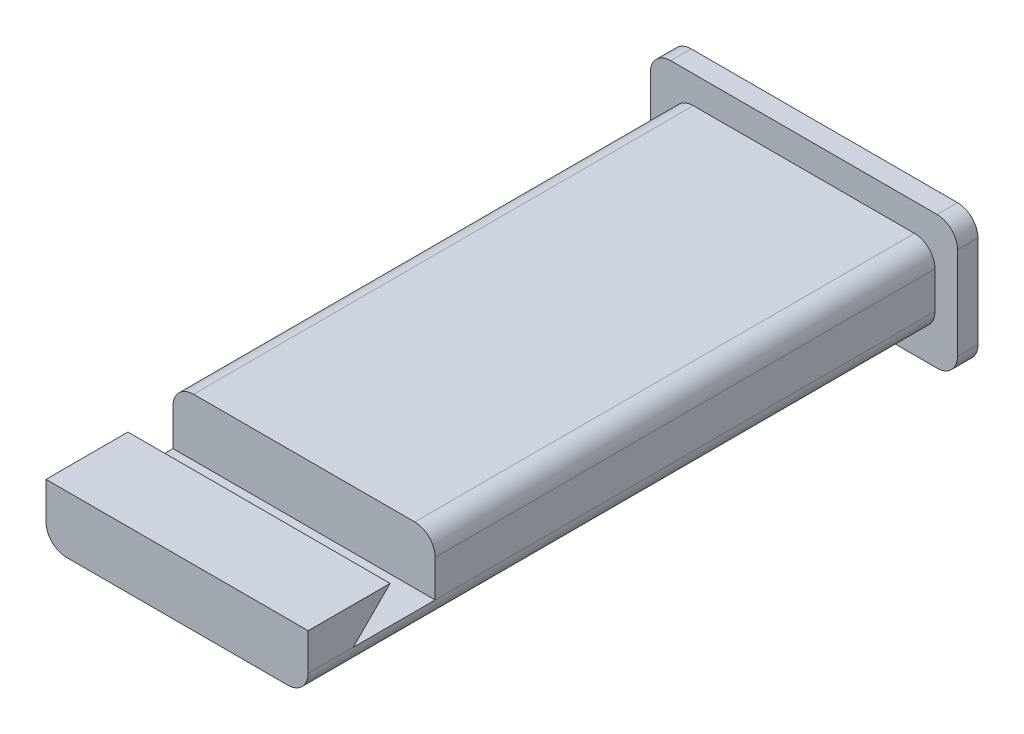
ISO-10303-21;
HEADER;
FILE_DESCRIPTION(('STEP AP214'),'2;1');
FILE_NAME('part.step','',(''),(''),'','','');
FILE_SCHEMA(('AUTOMOTIVE_DESIGN { 1 0 10303 214 1 1 1 1 }'));
ENDSEC;
DATA;
#1=APPLICATION_CONTEXT('core data for automotive mechanical design processes');
#2=APPLICATION_PROTOCOL_DEFINITION('international standard','automotive_design',2000,#1);
#3=PRODUCT_CONTEXT('',#1,'mechanical');
#4=PRODUCT('Part','Part','',(#3));
#5=PRODUCT_RELATED_PRODUCT_CATEGORY('part','',(#4));
#6=PRODUCT_DEFINITION_FORMATION('','',#4);
#7=PRODUCT_DEFINITION_CONTEXT('part definition',#1,'design');
#8=PRODUCT_DEFINITION('design','',#6,#7);
#9=PRODUCT_DEFINITION_SHAPE('','',#8);
#10=(LENGTH_UNIT() NAMED_UNIT(*) SI_UNIT(.MILLI.,.METRE.));
#11=(NAMED_UNIT(*) PLANE_ANGLE_UNIT() SI_UNIT($,.RADIAN.));
#12=(NAMED_UNIT(*) SI_UNIT($,.STERADIAN.) SOLID_ANGLE_UNIT());
#13=UNCERTAINTY_MEASURE_WITH_UNIT(LENGTH_MEASURE(1.E-05),#10,'distance_accuracy_value','');
#14=(GEOMETRIC_REPRESENTATION_CONTEXT(3) GLOBAL_UNCERTAINTY_ASSIGNED_CONTEXT((#13)) GLOBAL_UNIT_ASSIGNED_CONTEXT((#10,
#11,#12)) REPRESENTATION_CONTEXT('',''));
#15=CARTESIAN_POINT('',(0.,0.,0.));
#16=DIRECTION('',(0.,0.,1.));
#17=DIRECTION('',(1.,0.,0.));
#18=AXIS2_PLACEMENT_3D('',#15,#16,#17);
#19=CARTESIAN_POINT('',(12.8,-3.8,61.2));
#20=DIRECTION('',(-1.,0.,0.));
#21=DIRECTION('',(0.,0.,1.));
#22=AXIS2_PLACEMENT_3D('',#19,#20,#21);
#23=PLANE('',#22);
#24=DIRECTION('',(0.,0.,-1.));
#25=VECTOR('',#24,1.);
#26=CARTESIAN_POINT('',(12.8,1.8,61.2));
#27=LINE('',#26,#25);
#28=CARTESIAN_POINT('',(12.8,1.8,0.));
#29=VERTEX_POINT('',#28);
#30=CARTESIAN_POINT('',(12.8,1.8,48.8));
#31=VERTEX_POINT('',#30);
#32=EDGE_CURVE('E203',#29,#31,#27,.F.);
#33=ORIENTED_EDGE('',*,*,#32,.T.);
#34=DIRECTION('',(0.,-1.,0.));
#35=VECTOR('',#34,1.);
#36=CARTESIAN_POINT('',(12.8,3.8,48.8));
#37=LINE('',#36,#35);
#38=CARTESIAN_POINT('',(12.8,-1.8,48.8));
#39=VERTEX_POINT('',#38);
#40=EDGE_CURVE('E178',#31,#39,#37,.T.);
#41=ORIENTED_EDGE('',*,*,#40,.T.);
#42=DIRECTION('',(0.,0.,-1.));
#43=VECTOR('',#42,1.);
#44=CARTESIAN_POINT('',(12.8,-1.8,61.2));
#45=LINE('',#44,#43);
#46=CARTESIAN_POINT('',(12.8,-1.8,0.));
#47=VERTEX_POINT('',#46);
#48=EDGE_CURVE('E200',#39,#47,#45,.T.);
#49=ORIENTED_EDGE('',*,*,#48,.T.);
#50=DIRECTION('',(0.,1.,0.));
#51=VECTOR('',#50,1.);
#52=CARTESIAN_POINT('',(12.8,-3.8,0.));
#53=LINE('',#52,#51);
#54=EDGE_CURVE('E302',#47,#29,#53,.T.);
#55=ORIENTED_EDGE('',*,*,#54,.T.);
#56=EDGE_LOOP('',(#33,#41,#49,#55));
#57=FACE_BOUND('',#56,.T.);
#58=ADVANCED_FACE('F37',(#57),#23,.F.);
#59=CARTESIAN_POINT('',(-12.8,-3.8,61.2));
#60=DIRECTION('',(1.,0.,0.));
#61=DIRECTION('',(0.,0.,-1.));
#62=AXIS2_PLACEMENT_3D('',#59,#60,#61);
#63=PLANE('',#62);
#64=DIRECTION('',(0.,0.,-1.));
#65=VECTOR('',#64,1.);
#66=CARTESIAN_POINT('',(-12.8,-1.8,61.2));
#67=LINE('',#66,#65);
#68=CARTESIAN_POINT('',(-12.8,-1.8,0.));
#69=VERTEX_POINT('',#68);
#70=CARTESIAN_POINT('',(-12.8,-1.8,48.8));
#71=VERTEX_POINT('',#70);
#72=EDGE_CURVE('E330',#69,#71,#67,.F.);
#73=ORIENTED_EDGE('',*,*,#72,.T.);
#74=DIRECTION('',(0.,-1.,0.));
#75=VECTOR('',#74,1.);
#76=CARTESIAN_POINT('',(-12.8,3.8,48.8));
#77=LINE('',#76,#75);
#78=CARTESIAN_POINT('',(-12.8,1.8,48.8));
#79=VERTEX_POINT('',#78);
#80=EDGE_CURVE('E181',#79,#71,#77,.T.);
#81=ORIENTED_EDGE('',*,*,#80,.F.);
#82=DIRECTION('',(0.,0.,-1.));
#83=VECTOR('',#82,1.);
#84=CARTESIAN_POINT('',(-12.8,1.8,61.2));
#85=LINE('',#84,#83);
#86=CARTESIAN_POINT('',(-12.8,1.8,0.));
#87=VERTEX_POINT('',#86);
#88=EDGE_CURVE('E325',#79,#87,#85,.T.);
#89=ORIENTED_EDGE('',*,*,#88,.T.);
#90=DIRECTION('',(0.,-1.,0.));
#91=VECTOR('',#90,1.);
#92=CARTESIAN_POINT('',(-12.8,-3.8,0.));
#93=LINE('',#92,#91);
#94=EDGE_CURVE('E308',#87,#69,#93,.T.);
#95=ORIENTED_EDGE('',*,*,#94,.T.);
#96=EDGE_LOOP('',(#73,#81,#89,#95));
#97=FACE_BOUND('',#96,.T.);
#98=ADVANCED_FACE('F391',(#97),#63,.F.);
#99=CARTESIAN_POINT('',(12.8,-1.8,61.2));
#100=VERTEX_POINT('',#99);
#101=CARTESIAN_POINT('',(12.8,-1.8,56.8));
#102=VERTEX_POINT('',#101);
#103=EDGE_CURVE('E211',#100,#102,#45,.T.);
#104=ORIENTED_EDGE('',*,*,#103,.T.);
#105=DIRECTION('',(0.,0.707106781186544,-0.707106781186551));
#106=VECTOR('',#105,1.);
#107=CARTESIAN_POINT('',(12.8,-1.8,56.8));
#108=LINE('',#107,#106);
#109=CARTESIAN_POINT('',(12.8,1.8,53.2));
#110=VERTEX_POINT('',#109);
#111=EDGE_CURVE('E196',#102,#110,#108,.T.);
#112=ORIENTED_EDGE('',*,*,#111,.T.);
#113=DIRECTION('',(0.,0.,1.));
#114=VECTOR('',#113,1.);
#115=CARTESIAN_POINT('',(12.8,1.8,53.2));
#116=LINE('',#115,#114);
#117=CARTESIAN_POINT('',(12.8,1.8,61.2));
#118=VERTEX_POINT('',#117);
#119=EDGE_CURVE('E186',#110,#118,#116,.T.);
#120=ORIENTED_EDGE('',*,*,#119,.T.);
#121=DIRECTION('',(0.,1.,0.));
#122=VECTOR('',#121,1.);
#123=CARTESIAN_POINT('',(12.8,-3.8,61.2));
#124=LINE('',#123,#122);
#125=EDGE_CURVE('E291',#100,#118,#124,.T.);
#126=ORIENTED_EDGE('',*,*,#125,.F.);
#127=EDGE_LOOP('',(#104,#112,#120,#126));
#128=FACE_BOUND('',#127,.T.);
#129=ADVANCED_FACE('F353',(#128),#23,.F.);
#130=CARTESIAN_POINT('',(-12.8,3.8,61.2));
#131=DIRECTION('',(0.,-1.,0.));
#132=DIRECTION('',(0.,0.,-1.));
#133=AXIS2_PLACEMENT_3D('',#130,#131,#132);
#134=PLANE('',#133);
#135=DIRECTION('',(0.,0.,-1.));
#136=VECTOR('',#135,1.);
#137=CARTESIAN_POINT('',(-10.8,3.8,61.2));
#138=LINE('',#137,#136);
#139=CARTESIAN_POINT('',(-10.8,3.8,0.));
#140=VERTEX_POINT('',#139);
#141=CARTESIAN_POINT('',(-10.8,3.8,48.8));
#142=VERTEX_POINT('',#141);
#143=EDGE_CURVE('E213',#140,#142,#138,.F.);
#144=ORIENTED_EDGE('',*,*,#143,.T.);
#145=DIRECTION('',(-1.,0.,0.));
#146=VECTOR('',#145,1.);
#147=CARTESIAN_POINT('',(12.8,3.8,48.8));
#148=LINE('',#147,#146);
#149=CARTESIAN_POINT('',(10.8,3.8,48.8));
#150=VERTEX_POINT('',#149);
#151=EDGE_CURVE('E364',#150,#142,#148,.T.);
#152=ORIENTED_EDGE('',*,*,#151,.F.);
#153=DIRECTION('',(0.,0.,-1.));
#154=VECTOR('',#153,1.);
#155=CARTESIAN_POINT('',(10.8,3.8,61.2));
#156=LINE('',#155,#154);
#157=CARTESIAN_POINT('',(10.8,3.8,0.));
#158=VERTEX_POINT('',#157);
#159=EDGE_CURVE('E220',#150,#158,#156,.T.);
#160=ORIENTED_EDGE('',*,*,#159,.T.);
#161=DIRECTION('',(-1.,0.,0.));
#162=VECTOR('',#161,1.);
#163=CARTESIAN_POINT('',(-12.8,3.8,0.));
#164=LINE('',#163,#162);
#165=EDGE_CURVE('E304',#158,#140,#164,.T.);
#166=ORIENTED_EDGE('',*,*,#165,.T.);
#167=EDGE_LOOP('',(#144,#152,#160,#166));
#168=FACE_BOUND('',#167,.T.);
#169=ADVANCED_FACE('F402',(#168),#134,.F.);
#170=CARTESIAN_POINT('',(-12.8,1.8,61.2));
#171=VERTEX_POINT('',#170);
#172=CARTESIAN_POINT('',(-12.8,1.8,53.2));
#173=VERTEX_POINT('',#172);
#174=EDGE_CURVE('E326',#171,#173,#85,.T.);
#175=ORIENTED_EDGE('',*,*,#174,.T.);
#176=DIRECTION('',(0.,0.707106781186544,-0.707106781186551));
#177=VECTOR('',#176,1.);
#178=CARTESIAN_POINT('',(-12.8,-1.8,56.8));
#179=LINE('',#178,#177);
#180=CARTESIAN_POINT('',(-12.8,-1.8,56.8));
#181=VERTEX_POINT('',#180);
#182=EDGE_CURVE('E52',#181,#173,#179,.T.);
#183=ORIENTED_EDGE('',*,*,#182,.F.);
#184=CARTESIAN_POINT('',(-12.8,-1.8,61.2));
#185=VERTEX_POINT('',#184);
#186=EDGE_CURVE('E329',#181,#185,#67,.F.);
#187=ORIENTED_EDGE('',*,*,#186,.T.);
#188=DIRECTION('',(0.,-1.,0.));
#189=VECTOR('',#188,1.);
#190=CARTESIAN_POINT('',(-12.8,-3.8,61.2));
#191=LINE('',#190,#189);
#192=EDGE_CURVE('E294',#171,#185,#191,.T.);
#193=ORIENTED_EDGE('',*,*,#192,.F.);
#194=EDGE_LOOP('',(#175,#183,#187,#193));
#195=FACE_BOUND('',#194,.T.);
#196=ADVANCED_FACE('F398',(#195),#63,.F.);
#197=CARTESIAN_POINT('',(-12.8,-3.8,61.2));
#198=DIRECTION('',(0.,1.,0.));
#199=DIRECTION('',(0.,0.,1.));
#200=AXIS2_PLACEMENT_3D('',#197,#198,#199);
#201=PLANE('',#200);
#202=DIRECTION('',(1.,0.,0.));
#203=VECTOR('',#202,1.);
#204=CARTESIAN_POINT('',(-12.8,-3.8,61.2));
#205=LINE('',#204,#203);
#206=CARTESIAN_POINT('',(-10.8,-3.8,61.2));
#207=VERTEX_POINT('',#206);
#208=CARTESIAN_POINT('',(10.8,-3.8,61.2));
#209=VERTEX_POINT('',#208);
#210=EDGE_CURVE('E298',#207,#209,#205,.T.);
#211=ORIENTED_EDGE('',*,*,#210,.F.);
#212=DIRECTION('',(0.,0.,-1.));
#213=VECTOR('',#212,1.);
#214=CARTESIAN_POINT('',(-10.8,-3.8,61.2));
#215=LINE('',#214,#213);
#216=CARTESIAN_POINT('',(-10.8,-3.8,0.));
#217=VERTEX_POINT('',#216);
#218=EDGE_CURVE('E312',#207,#217,#215,.T.);
#219=ORIENTED_EDGE('',*,*,#218,.T.);
#220=DIRECTION('',(1.,0.,0.));
#221=VECTOR('',#220,1.);
#222=CARTESIAN_POINT('',(-12.8,-3.8,0.));
#223=LINE('',#222,#221);
#224=CARTESIAN_POINT('',(10.8,-3.8,0.));
#225=VERTEX_POINT('',#224);
#226=EDGE_CURVE('E295',#217,#225,#223,.T.);
#227=ORIENTED_EDGE('',*,*,#226,.T.);
#228=DIRECTION('',(0.,0.,-1.));
#229=VECTOR('',#228,1.);
#230=CARTESIAN_POINT('',(10.8,-3.8,61.2));
#231=LINE('',#230,#229);
#232=EDGE_CURVE('E301',#225,#209,#231,.F.);
#233=ORIENTED_EDGE('',*,*,#232,.T.);
#234=EDGE_LOOP('',(#211,#219,#227,#233));
#235=FACE_BOUND('',#234,.T.);
#236=ADVANCED_FACE('F344',(#235),#201,.F.);
#237=CARTESIAN_POINT('',(0.,0.,61.2));
#238=DIRECTION('',(0.,0.,-1.));
#239=DIRECTION('',(-1.,0.,0.));
#240=AXIS2_PLACEMENT_3D('',#237,#238,#239);
#241=PLANE('',#240);
#242=ORIENTED_EDGE('',*,*,#125,.T.);
#243=DIRECTION('',(-1.,0.,0.));
#244=VECTOR('',#243,1.);
#245=CARTESIAN_POINT('',(12.8,1.8,61.2));
#246=LINE('',#245,#244);
#247=EDGE_CURVE('E367',#118,#171,#246,.T.);
#248=ORIENTED_EDGE('',*,*,#247,.T.);
#249=ORIENTED_EDGE('',*,*,#192,.T.);
#250=CARTESIAN_POINT('',(-10.8,-1.8,61.2));
#251=DIRECTION('',(0.,0.,-1.));
#252=DIRECTION('',(-1.,0.,0.));
#253=AXIS2_PLACEMENT_3D('',#250,#251,#252);
#254=CIRCLE('',#253,2.);
#255=EDGE_CURVE('E214',#185,#207,#254,.F.);
#256=ORIENTED_EDGE('',*,*,#255,.T.);
#257=ORIENTED_EDGE('',*,*,#210,.T.);
#258=CARTESIAN_POINT('',(10.8,-1.8,61.2));
#259=DIRECTION('',(0.,0.,-1.));
#260=DIRECTION('',(-1.,0.,0.));
#261=AXIS2_PLACEMENT_3D('',#258,#259,#260);
#262=CIRCLE('',#261,2.);
#263=EDGE_CURVE('E333',#209,#100,#262,.F.);
#264=ORIENTED_EDGE('',*,*,#263,.T.);
#265=EDGE_LOOP('',(#242,#248,#249,#256,#257,#264));
#266=FACE_BOUND('',#265,.T.);
#267=ADVANCED_FACE('F337',(#266),#241,.F.);
#268=CARTESIAN_POINT('',(-10.8,-1.8,61.2));
#269=DIRECTION('',(0.,0.,-1.));
#270=DIRECTION('',(-1.,0.,0.));
#271=AXIS2_PLACEMENT_3D('',#268,#269,#270);
#272=CYLINDRICAL_SURFACE('',#271,2.);
#273=ORIENTED_EDGE('',*,*,#255,.F.);
#274=ORIENTED_EDGE('',*,*,#186,.F.);
#275=DIRECTION('',(0.,0.,1.));
#276=VECTOR('',#275,1.);
#277=CARTESIAN_POINT('',(-12.8,-1.8,48.8));
#278=LINE('',#277,#276);
#279=EDGE_CURVE('E361',#71,#181,#278,.T.);
#280=ORIENTED_EDGE('',*,*,#279,.F.);
#281=ORIENTED_EDGE('',*,*,#72,.F.);
#282=CARTESIAN_POINT('',(-10.8,-1.8,0.));
#283=DIRECTION('',(0.,0.,-1.));
#284=DIRECTION('',(-1.,0.,0.));
#285=AXIS2_PLACEMENT_3D('',#282,#283,#284);
#286=CIRCLE('',#285,2.);
#287=EDGE_CURVE('E322',#217,#69,#286,.T.);
#288=ORIENTED_EDGE('',*,*,#287,.F.);
#289=ORIENTED_EDGE('',*,*,#218,.F.);
#290=EDGE_LOOP('',(#273,#274,#280,#281,#288,#289));
#291=FACE_BOUND('',#290,.T.);
#292=ADVANCED_FACE('F346',(#291),#272,.T.);
#293=CARTESIAN_POINT('',(10.8,-1.8,61.2));
#294=DIRECTION('',(0.,0.,-1.));
#295=DIRECTION('',(-1.,0.,0.));
#296=AXIS2_PLACEMENT_3D('',#293,#294,#295);
#297=CYLINDRICAL_SURFACE('',#296,2.);
#298=ORIENTED_EDGE('',*,*,#263,.F.);
#299=ORIENTED_EDGE('',*,*,#232,.F.);
#300=CARTESIAN_POINT('',(10.8,-1.8,0.));
#301=DIRECTION('',(0.,0.,-1.));
#302=DIRECTION('',(-1.,0.,0.));
#303=AXIS2_PLACEMENT_3D('',#300,#301,#302);
#304=CIRCLE('',#303,2.);
#305=EDGE_CURVE('E209',#47,#225,#304,.T.);
#306=ORIENTED_EDGE('',*,*,#305,.F.);
#307=ORIENTED_EDGE('',*,*,#48,.F.);
#308=DIRECTION('',(0.,0.,1.));
#309=VECTOR('',#308,1.);
#310=CARTESIAN_POINT('',(12.8,-1.8,48.8));
#311=LINE('',#310,#309);
#312=EDGE_CURVE('E189',#39,#102,#311,.T.);
#313=ORIENTED_EDGE('',*,*,#312,.T.);
#314=ORIENTED_EDGE('',*,*,#103,.F.);
#315=EDGE_LOOP('',(#298,#299,#306,#307,#313,#314));
#316=FACE_BOUND('',#315,.T.);
#317=ADVANCED_FACE('F206',(#316),#297,.T.);
#318=CARTESIAN_POINT('',(10.8,1.8,61.2));
#319=DIRECTION('',(0.,0.,-1.));
#320=DIRECTION('',(-1.,0.,0.));
#321=AXIS2_PLACEMENT_3D('',#318,#319,#320);
#322=CYLINDRICAL_SURFACE('',#321,2.);
#323=CARTESIAN_POINT('',(10.8,1.8,48.8));
#324=DIRECTION('',(0.,0.,-1.));
#325=DIRECTION('',(-1.,0.,0.));
#326=AXIS2_PLACEMENT_3D('',#323,#324,#325);
#327=CIRCLE('',#326,2.);
#328=EDGE_CURVE('E366',#31,#150,#327,.F.);
#329=ORIENTED_EDGE('',*,*,#328,.F.);
#330=ORIENTED_EDGE('',*,*,#32,.F.);
#331=CARTESIAN_POINT('',(10.8,1.8,0.));
#332=DIRECTION('',(0.,0.,-1.));
#333=DIRECTION('',(-1.,0.,0.));
#334=AXIS2_PLACEMENT_3D('',#331,#332,#333);
#335=CIRCLE('',#334,2.);
#336=EDGE_CURVE('E318',#158,#29,#335,.T.);
#337=ORIENTED_EDGE('',*,*,#336,.F.);
#338=ORIENTED_EDGE('',*,*,#159,.F.);
#339=EDGE_LOOP('',(#329,#330,#337,#338));
#340=FACE_BOUND('',#339,.T.);
#341=ADVANCED_FACE('F449',(#340),#322,.T.);
#342=CARTESIAN_POINT('',(-10.8,1.8,61.2));
#343=DIRECTION('',(0.,0.,-1.));
#344=DIRECTION('',(-1.,0.,0.));
#345=AXIS2_PLACEMENT_3D('',#342,#343,#344);
#346=CYLINDRICAL_SURFACE('',#345,2.);
#347=CARTESIAN_POINT('',(-10.8,1.8,48.8));
#348=DIRECTION('',(0.,0.,-1.));
#349=DIRECTION('',(-1.,0.,0.));
#350=AXIS2_PLACEMENT_3D('',#347,#348,#349);
#351=CIRCLE('',#350,2.);
#352=EDGE_CURVE('E12',#142,#79,#351,.F.);
#353=ORIENTED_EDGE('',*,*,#352,.F.);
#354=ORIENTED_EDGE('',*,*,#143,.F.);
#355=CARTESIAN_POINT('',(-10.8,1.8,0.));
#356=DIRECTION('',(0.,0.,-1.));
#357=DIRECTION('',(-1.,0.,0.));
#358=AXIS2_PLACEMENT_3D('',#355,#356,#357);
#359=CIRCLE('',#358,2.);
#360=EDGE_CURVE('E315',#87,#140,#359,.T.);
#361=ORIENTED_EDGE('',*,*,#360,.F.);
#362=ORIENTED_EDGE('',*,*,#88,.F.);
#363=EDGE_LOOP('',(#353,#354,#361,#362));
#364=FACE_BOUND('',#363,.T.);
#365=ADVANCED_FACE('F418',(#364),#346,.T.);
#366=CARTESIAN_POINT('',(-15.,-6.5,-2.));
#367=DIRECTION('',(1.,0.,0.));
#368=DIRECTION('',(0.,0.,-1.));
#369=AXIS2_PLACEMENT_3D('',#366,#367,#368);
#370=PLANE('',#369);
#371=DIRECTION('',(0.,1.,0.));
#372=VECTOR('',#371,1.);
#373=CARTESIAN_POINT('',(-15.,-6.5,-2.));
#374=LINE('',#373,#372);
#375=CARTESIAN_POINT('',(-15.,-4.5,-2.));
#376=VERTEX_POINT('',#375);
#377=CARTESIAN_POINT('',(-15.,4.5,-2.));
#378=VERTEX_POINT('',#377);
#379=EDGE_CURVE('E272',#376,#378,#374,.T.);
#380=ORIENTED_EDGE('',*,*,#379,.F.);
#381=DIRECTION('',(0.,0.,1.));
#382=VECTOR('',#381,1.);
#383=CARTESIAN_POINT('',(-15.,-4.5,-2.));
#384=LINE('',#383,#382);
#385=CARTESIAN_POINT('',(-15.,-4.5,0.));
#386=VERTEX_POINT('',#385);
#387=EDGE_CURVE('E224',#376,#386,#384,.T.);
#388=ORIENTED_EDGE('',*,*,#387,.T.);
#389=DIRECTION('',(0.,1.,0.));
#390=VECTOR('',#389,1.);
#391=CARTESIAN_POINT('',(-15.,-6.5,0.));
#392=LINE('',#391,#390);
#393=CARTESIAN_POINT('',(-15.,4.5,0.));
#394=VERTEX_POINT('',#393);
#395=EDGE_CURVE('E287',#386,#394,#392,.T.);
#396=ORIENTED_EDGE('',*,*,#395,.T.);
#397=DIRECTION('',(0.,0.,1.));
#398=VECTOR('',#397,1.);
#399=CARTESIAN_POINT('',(-15.,4.5,-2.));
#400=LINE('',#399,#398);
#401=EDGE_CURVE('E222',#394,#378,#400,.F.);
#402=ORIENTED_EDGE('',*,*,#401,.T.);
#403=EDGE_LOOP('',(#380,#388,#396,#402));
#404=FACE_BOUND('',#403,.T.);
#405=ADVANCED_FACE('F379',(#404),#370,.F.);
#406=CARTESIAN_POINT('',(15.,6.5,-2.));
#407=DIRECTION('',(0.,-1.,0.));
#408=DIRECTION('',(0.,0.,-1.));
#409=AXIS2_PLACEMENT_3D('',#406,#407,#408);
#410=PLANE('',#409);
#411=DIRECTION('',(1.,0.,0.));
#412=VECTOR('',#411,1.);
#413=CARTESIAN_POINT('',(15.,6.5,0.));
#414=LINE('',#413,#412);
#415=CARTESIAN_POINT('',(-13.,6.5,0.));
#416=VERTEX_POINT('',#415);
#417=CARTESIAN_POINT('',(13.,6.5,0.));
#418=VERTEX_POINT('',#417);
#419=EDGE_CURVE('E263',#416,#418,#414,.T.);
#420=ORIENTED_EDGE('',*,*,#419,.T.);
#421=DIRECTION('',(0.,0.,1.));
#422=VECTOR('',#421,1.);
#423=CARTESIAN_POINT('',(13.,6.5,-2.));
#424=LINE('',#423,#422);
#425=CARTESIAN_POINT('',(13.,6.5,-2.));
#426=VERTEX_POINT('',#425);
#427=EDGE_CURVE('E45',#418,#426,#424,.F.);
#428=ORIENTED_EDGE('',*,*,#427,.T.);
#429=DIRECTION('',(1.,0.,0.));
#430=VECTOR('',#429,1.);
#431=CARTESIAN_POINT('',(15.,6.5,-2.));
#432=LINE('',#431,#430);
#433=CARTESIAN_POINT('',(-13.,6.5,-2.));
#434=VERTEX_POINT('',#433);
#435=EDGE_CURVE('E260',#434,#426,#432,.T.);
#436=ORIENTED_EDGE('',*,*,#435,.F.);
#437=DIRECTION('',(0.,0.,1.));
#438=VECTOR('',#437,1.);
#439=CARTESIAN_POINT('',(-13.,6.5,-2.));
#440=LINE('',#439,#438);
#441=EDGE_CURVE('E252',#434,#416,#440,.T.);
#442=ORIENTED_EDGE('',*,*,#441,.T.);
#443=EDGE_LOOP('',(#420,#428,#436,#442));
#444=FACE_BOUND('',#443,.T.);
#445=ADVANCED_FACE('F259',(#444),#410,.F.);
#446=CARTESIAN_POINT('',(15.,-6.5,-2.));
#447=DIRECTION('',(-1.,0.,0.));
#448=DIRECTION('',(0.,0.,1.));
#449=AXIS2_PLACEMENT_3D('',#446,#447,#448);
#450=PLANE('',#449);
#451=DIRECTION('',(0.,-1.,0.));
#452=VECTOR('',#451,1.);
#453=CARTESIAN_POINT('',(15.,-6.5,0.));
#454=LINE('',#453,#452);
#455=CARTESIAN_POINT('',(15.,4.5,0.));
#456=VERTEX_POINT('',#455);
#457=CARTESIAN_POINT('',(15.,-4.5,0.));
#458=VERTEX_POINT('',#457);
#459=EDGE_CURVE('E278',#456,#458,#454,.T.);
#460=ORIENTED_EDGE('',*,*,#459,.T.);
#461=DIRECTION('',(0.,0.,1.));
#462=VECTOR('',#461,1.);
#463=CARTESIAN_POINT('',(15.,-4.5,-2.));
#464=LINE('',#463,#462);
#465=CARTESIAN_POINT('',(15.,-4.5,-2.));
#466=VERTEX_POINT('',#465);
#467=EDGE_CURVE('E60',#458,#466,#464,.F.);
#468=ORIENTED_EDGE('',*,*,#467,.T.);
#469=DIRECTION('',(0.,-1.,0.));
#470=VECTOR('',#469,1.);
#471=CARTESIAN_POINT('',(15.,-6.5,-2.));
#472=LINE('',#471,#470);
#473=CARTESIAN_POINT('',(15.,4.5,-2.));
#474=VERTEX_POINT('',#473);
#475=EDGE_CURVE('E271',#474,#466,#472,.T.);
#476=ORIENTED_EDGE('',*,*,#475,.F.);
#477=DIRECTION('',(0.,0.,1.));
#478=VECTOR('',#477,1.);
#479=CARTESIAN_POINT('',(15.,4.5,-2.));
#480=LINE('',#479,#478);
#481=EDGE_CURVE('E248',#474,#456,#480,.T.);
#482=ORIENTED_EDGE('',*,*,#481,.T.);
#483=EDGE_LOOP('',(#460,#468,#476,#482));
#484=FACE_BOUND('',#483,.T.);
#485=ADVANCED_FACE('F277',(#484),#450,.F.);
#486=CARTESIAN_POINT('',(15.,-6.5,-2.));
#487=DIRECTION('',(0.,1.,0.));
#488=DIRECTION('',(0.,0.,1.));
#489=AXIS2_PLACEMENT_3D('',#486,#487,#488);
#490=PLANE('',#489);
#491=DIRECTION('',(-1.,0.,0.));
#492=VECTOR('',#491,1.);
#493=CARTESIAN_POINT('',(15.,-6.5,0.));
#494=LINE('',#493,#492);
#495=CARTESIAN_POINT('',(13.,-6.5,0.));
#496=VERTEX_POINT('',#495);
#497=CARTESIAN_POINT('',(-13.,-6.5,0.));
#498=VERTEX_POINT('',#497);
#499=EDGE_CURVE('E283',#496,#498,#494,.T.);
#500=ORIENTED_EDGE('',*,*,#499,.T.);
#501=DIRECTION('',(0.,0.,1.));
#502=VECTOR('',#501,1.);
#503=CARTESIAN_POINT('',(-13.,-6.5,-2.));
#504=LINE('',#503,#502);
#505=CARTESIAN_POINT('',(-13.,-6.5,-2.));
#506=VERTEX_POINT('',#505);
#507=EDGE_CURVE('E238',#498,#506,#504,.F.);
#508=ORIENTED_EDGE('',*,*,#507,.T.);
#509=DIRECTION('',(-1.,0.,0.));
#510=VECTOR('',#509,1.);
#511=CARTESIAN_POINT('',(15.,-6.5,-2.));
#512=LINE('',#511,#510);
#513=CARTESIAN_POINT('',(13.,-6.5,-2.));
#514=VERTEX_POINT('',#513);
#515=EDGE_CURVE('E305',#514,#506,#512,.T.);
#516=ORIENTED_EDGE('',*,*,#515,.F.);
#517=DIRECTION('',(0.,0.,1.));
#518=VECTOR('',#517,1.);
#519=CARTESIAN_POINT('',(13.,-6.5,-2.));
#520=LINE('',#519,#518);
#521=EDGE_CURVE('E235',#514,#496,#520,.T.);
#522=ORIENTED_EDGE('',*,*,#521,.T.);
#523=EDGE_LOOP('',(#500,#508,#516,#522));
#524=FACE_BOUND('',#523,.T.);
#525=ADVANCED_FACE('F423',(#524),#490,.F.);
#526=CARTESIAN_POINT('',(0.,0.,-2.));
#527=DIRECTION('',(0.,0.,1.));
#528=DIRECTION('',(1.,0.,0.));
#529=AXIS2_PLACEMENT_3D('',#526,#527,#528);
#530=PLANE('',#529);
#531=ORIENTED_EDGE('',*,*,#515,.T.);
#532=CARTESIAN_POINT('',(-13.,-4.5,-2.));
#533=DIRECTION('',(0.,0.,1.));
#534=DIRECTION('',(1.,0.,0.));
#535=AXIS2_PLACEMENT_3D('',#532,#533,#534);
#536=CIRCLE('',#535,2.);
#537=EDGE_CURVE('E246',#506,#376,#536,.F.);
#538=ORIENTED_EDGE('',*,*,#537,.T.);
#539=ORIENTED_EDGE('',*,*,#379,.T.);
#540=CARTESIAN_POINT('',(-13.,4.5,-2.));
#541=DIRECTION('',(0.,0.,1.));
#542=DIRECTION('',(1.,0.,0.));
#543=AXIS2_PLACEMENT_3D('',#540,#541,#542);
#544=CIRCLE('',#543,2.);
#545=EDGE_CURVE('E240',#378,#434,#544,.F.);
#546=ORIENTED_EDGE('',*,*,#545,.T.);
#547=ORIENTED_EDGE('',*,*,#435,.T.);
#548=CARTESIAN_POINT('',(13.,4.5,-2.));
#549=DIRECTION('',(0.,0.,1.));
#550=DIRECTION('',(1.,0.,0.));
#551=AXIS2_PLACEMENT_3D('',#548,#549,#550);
#552=CIRCLE('',#551,2.);
#553=EDGE_CURVE('E242',#426,#474,#552,.F.);
#554=ORIENTED_EDGE('',*,*,#553,.T.);
#555=ORIENTED_EDGE('',*,*,#475,.T.);
#556=CARTESIAN_POINT('',(13.,-4.5,-2.));
#557=DIRECTION('',(0.,0.,1.));
#558=DIRECTION('',(1.,0.,0.));
#559=AXIS2_PLACEMENT_3D('',#556,#557,#558);
#560=CIRCLE('',#559,2.);
#561=EDGE_CURVE('E244',#466,#514,#560,.F.);
#562=ORIENTED_EDGE('',*,*,#561,.T.);
#563=EDGE_LOOP('',(#531,#538,#539,#546,#547,#554,#555,#562));
#564=FACE_BOUND('',#563,.T.);
#565=ADVANCED_FACE('F268',(#564),#530,.F.);
#566=CARTESIAN_POINT('',(0.,0.,0.));
#567=DIRECTION('',(0.,0.,1.));
#568=DIRECTION('',(1.,0.,0.));
#569=AXIS2_PLACEMENT_3D('',#566,#567,#568);
#570=PLANE('',#569);
#571=ORIENTED_EDGE('',*,*,#54,.F.);
#572=ORIENTED_EDGE('',*,*,#305,.T.);
#573=ORIENTED_EDGE('',*,*,#226,.F.);
#574=ORIENTED_EDGE('',*,*,#287,.T.);
#575=ORIENTED_EDGE('',*,*,#94,.F.);
#576=ORIENTED_EDGE('',*,*,#360,.T.);
#577=ORIENTED_EDGE('',*,*,#165,.F.);
#578=ORIENTED_EDGE('',*,*,#336,.T.);
#579=EDGE_LOOP('',(#571,#572,#573,#574,#575,#576,#577,#578));
#580=FACE_BOUND('',#579,.T.);
#581=ORIENTED_EDGE('',*,*,#395,.F.);
#582=CARTESIAN_POINT('',(-13.,-4.5,0.));
#583=DIRECTION('',(0.,0.,1.));
#584=DIRECTION('',(1.,0.,0.));
#585=AXIS2_PLACEMENT_3D('',#582,#583,#584);
#586=CIRCLE('',#585,2.);
#587=EDGE_CURVE('E233',#386,#498,#586,.T.);
#588=ORIENTED_EDGE('',*,*,#587,.T.);
#589=ORIENTED_EDGE('',*,*,#499,.F.);
#590=CARTESIAN_POINT('',(13.,-4.5,0.));
#591=DIRECTION('',(0.,0.,1.));
#592=DIRECTION('',(1.,0.,0.));
#593=AXIS2_PLACEMENT_3D('',#590,#591,#592);
#594=CIRCLE('',#593,2.);
#595=EDGE_CURVE('E231',#496,#458,#594,.T.);
#596=ORIENTED_EDGE('',*,*,#595,.T.);
#597=ORIENTED_EDGE('',*,*,#459,.F.);
#598=CARTESIAN_POINT('',(13.,4.5,0.));
#599=DIRECTION('',(0.,0.,1.));
#600=DIRECTION('',(1.,0.,0.));
#601=AXIS2_PLACEMENT_3D('',#598,#599,#600);
#602=CIRCLE('',#601,2.);
#603=EDGE_CURVE('E229',#456,#418,#602,.T.);
#604=ORIENTED_EDGE('',*,*,#603,.T.);
#605=ORIENTED_EDGE('',*,*,#419,.F.);
#606=CARTESIAN_POINT('',(-13.,4.5,0.));
#607=DIRECTION('',(0.,0.,1.));
#608=DIRECTION('',(1.,0.,0.));
#609=AXIS2_PLACEMENT_3D('',#606,#607,#608);
#610=CIRCLE('',#609,2.);
#611=EDGE_CURVE('E227',#416,#394,#610,.T.);
#612=ORIENTED_EDGE('',*,*,#611,.T.);
#613=EDGE_LOOP('',(#581,#588,#589,#596,#597,#604,#605,#612));
#614=FACE_BOUND('',#613,.T.);
#615=ADVANCED_FACE('F281',(#580,#614),#570,.T.);
#616=CARTESIAN_POINT('',(-13.,-4.5,-2.));
#617=DIRECTION('',(0.,0.,1.));
#618=DIRECTION('',(1.,0.,0.));
#619=AXIS2_PLACEMENT_3D('',#616,#617,#618);
#620=CYLINDRICAL_SURFACE('',#619,2.);
#621=ORIENTED_EDGE('',*,*,#537,.F.);
#622=ORIENTED_EDGE('',*,*,#507,.F.);
#623=ORIENTED_EDGE('',*,*,#587,.F.);
#624=ORIENTED_EDGE('',*,*,#387,.F.);
#625=EDGE_LOOP('',(#621,#622,#623,#624));
#626=FACE_BOUND('',#625,.T.);
#627=ADVANCED_FACE('F429',(#626),#620,.T.);
#628=CARTESIAN_POINT('',(13.,-4.5,-2.));
#629=DIRECTION('',(0.,0.,1.));
#630=DIRECTION('',(1.,0.,0.));
#631=AXIS2_PLACEMENT_3D('',#628,#629,#630);
#632=CYLINDRICAL_SURFACE('',#631,2.);
#633=ORIENTED_EDGE('',*,*,#561,.F.);
#634=ORIENTED_EDGE('',*,*,#467,.F.);
#635=ORIENTED_EDGE('',*,*,#595,.F.);
#636=ORIENTED_EDGE('',*,*,#521,.F.);
#637=EDGE_LOOP('',(#633,#634,#635,#636));
#638=FACE_BOUND('',#637,.T.);
#639=ADVANCED_FACE('F389',(#638),#632,.T.);
#640=CARTESIAN_POINT('',(13.,4.5,-2.));
#641=DIRECTION('',(0.,0.,1.));
#642=DIRECTION('',(1.,0.,0.));
#643=AXIS2_PLACEMENT_3D('',#640,#641,#642);
#644=CYLINDRICAL_SURFACE('',#643,2.);
#645=ORIENTED_EDGE('',*,*,#553,.F.);
#646=ORIENTED_EDGE('',*,*,#427,.F.);
#647=ORIENTED_EDGE('',*,*,#603,.F.);
#648=ORIENTED_EDGE('',*,*,#481,.F.);
#649=EDGE_LOOP('',(#645,#646,#647,#648));
#650=FACE_BOUND('',#649,.T.);
#651=ADVANCED_FACE('F275',(#650),#644,.T.);
#652=CARTESIAN_POINT('',(-13.,4.5,-2.));
#653=DIRECTION('',(0.,0.,1.));
#654=DIRECTION('',(1.,0.,0.));
#655=AXIS2_PLACEMENT_3D('',#652,#653,#654);
#656=CYLINDRICAL_SURFACE('',#655,2.);
#657=ORIENTED_EDGE('',*,*,#545,.F.);
#658=ORIENTED_EDGE('',*,*,#401,.F.);
#659=ORIENTED_EDGE('',*,*,#611,.F.);
#660=ORIENTED_EDGE('',*,*,#441,.F.);
#661=EDGE_LOOP('',(#657,#658,#659,#660));
#662=FACE_BOUND('',#661,.T.);
#663=ADVANCED_FACE('F39',(#662),#656,.T.);
#664=CARTESIAN_POINT('',(12.8,3.8,48.8));
#665=DIRECTION('',(0.,0.,-1.));
#666=DIRECTION('',(-1.,0.,0.));
#667=AXIS2_PLACEMENT_3D('',#664,#665,#666);
#668=PLANE('',#667);
#669=ORIENTED_EDGE('',*,*,#328,.T.);
#670=ORIENTED_EDGE('',*,*,#151,.T.);
#671=ORIENTED_EDGE('',*,*,#352,.T.);
#672=ORIENTED_EDGE('',*,*,#80,.T.);
#673=DIRECTION('',(-1.,0.,0.));
#674=VECTOR('',#673,1.);
#675=CARTESIAN_POINT('',(12.8,-1.8,48.8));
#676=LINE('',#675,#674);
#677=EDGE_CURVE('E174',#39,#71,#676,.T.);
#678=ORIENTED_EDGE('',*,*,#677,.F.);
#679=ORIENTED_EDGE('',*,*,#40,.F.);
#680=EDGE_LOOP('',(#669,#670,#671,#672,#678,#679));
#681=FACE_BOUND('',#680,.T.);
#682=ADVANCED_FACE('F176',(#681),#668,.F.);
#683=CARTESIAN_POINT('',(12.8,1.8,53.2));
#684=DIRECTION('',(0.,-1.,0.));
#685=DIRECTION('',(0.,0.,-1.));
#686=AXIS2_PLACEMENT_3D('',#683,#684,#685);
#687=PLANE('',#686);
#688=ORIENTED_EDGE('',*,*,#174,.F.);
#689=ORIENTED_EDGE('',*,*,#247,.F.);
#690=ORIENTED_EDGE('',*,*,#119,.F.);
#691=DIRECTION('',(-1.,0.,0.));
#692=VECTOR('',#691,1.);
#693=CARTESIAN_POINT('',(12.8,1.8,53.2));
#694=LINE('',#693,#692);
#695=EDGE_CURVE('E369',#110,#173,#694,.T.);
#696=ORIENTED_EDGE('',*,*,#695,.T.);
#697=EDGE_LOOP('',(#688,#689,#690,#696));
#698=FACE_BOUND('',#697,.T.);
#699=ADVANCED_FACE('F387',(#698),#687,.F.);
#700=CARTESIAN_POINT('',(12.8,-1.8,56.8));
#701=DIRECTION('',(0.,0.707106781186551,0.707106781186544));
#702=DIRECTION('',(0.,-0.707106781186544,0.707106781186551));
#703=AXIS2_PLACEMENT_3D('',#700,#701,#702);
#704=PLANE('',#703);
#705=ORIENTED_EDGE('',*,*,#182,.T.);
#706=ORIENTED_EDGE('',*,*,#695,.F.);
#707=ORIENTED_EDGE('',*,*,#111,.F.);
#708=DIRECTION('',(-1.,0.,0.));
#709=VECTOR('',#708,1.);
#710=CARTESIAN_POINT('',(12.8,-1.8,56.8));
#711=LINE('',#710,#709);
#712=EDGE_CURVE('E185',#102,#181,#711,.T.);
#713=ORIENTED_EDGE('',*,*,#712,.T.);
#714=EDGE_LOOP('',(#705,#706,#707,#713));
#715=FACE_BOUND('',#714,.T.);
#716=ADVANCED_FACE('F434',(#715),#704,.F.);
#717=CARTESIAN_POINT('',(12.8,-1.8,48.8));
#718=DIRECTION('',(0.,-1.,0.));
#719=DIRECTION('',(0.,0.,-1.));
#720=AXIS2_PLACEMENT_3D('',#717,#718,#719);
#721=PLANE('',#720);
#722=ORIENTED_EDGE('',*,*,#279,.T.);
#723=ORIENTED_EDGE('',*,*,#712,.F.);
#724=ORIENTED_EDGE('',*,*,#312,.F.);
#725=ORIENTED_EDGE('',*,*,#677,.T.);
#726=EDGE_LOOP('',(#722,#723,#724,#725));
#727=FACE_BOUND('',#726,.T.);
#728=ADVANCED_FACE('F190',(#727),#721,.F.);
#729=CLOSED_SHELL('',(#58,#98,#129,#169,#196,#236,#267,#292,#317,#341,#365,#405,#445,#485,#525,
#565,#615,#627,#639,#651,#663,#682,#699,#716,#728));
#730=MANIFOLD_SOLID_BREP('B2',#729);
#731=ADVANCED_BREP_SHAPE_REPRESENTATION('',(#18,#730),#14);
#732=SHAPE_DEFINITION_REPRESENTATION(#9,#731);
ENDSEC;
END-ISO-10303-21;
